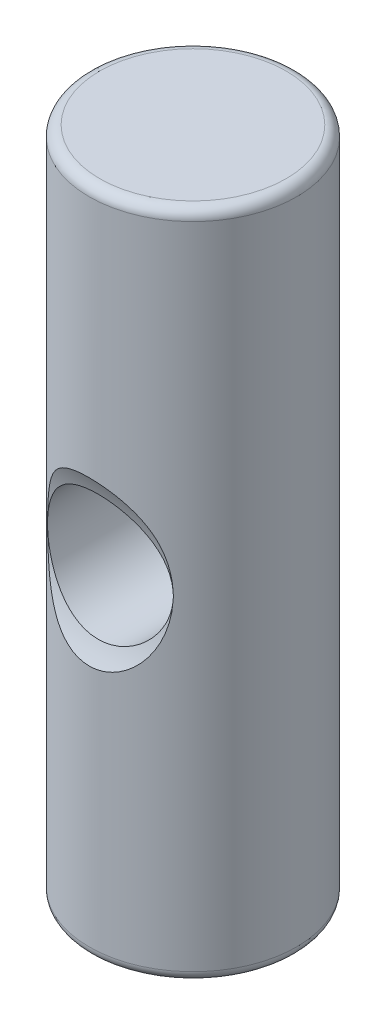
ISO-10303-21;
HEADER;
FILE_DESCRIPTION(('STEP AP214'),'2;1');
FILE_NAME('part.step','',(''),(''),'','','');
FILE_SCHEMA(('AUTOMOTIVE_DESIGN { 1 0 10303 214 1 1 1 1 }'));
ENDSEC;
DATA;
#1=APPLICATION_CONTEXT('core data for automotive mechanical design processes');
#2=APPLICATION_PROTOCOL_DEFINITION('international standard','automotive_design',2000,#1);
#3=PRODUCT_CONTEXT('',#1,'mechanical');
#4=PRODUCT('Part','Part','',(#3));
#5=PRODUCT_RELATED_PRODUCT_CATEGORY('part','',(#4));
#6=PRODUCT_DEFINITION_FORMATION('','',#4);
#7=PRODUCT_DEFINITION_CONTEXT('part definition',#1,'design');
#8=PRODUCT_DEFINITION('design','',#6,#7);
#9=PRODUCT_DEFINITION_SHAPE('','',#8);
#10=(LENGTH_UNIT() NAMED_UNIT(*) SI_UNIT(.MILLI.,.METRE.));
#11=(NAMED_UNIT(*) PLANE_ANGLE_UNIT() SI_UNIT($,.RADIAN.));
#12=(NAMED_UNIT(*) SI_UNIT($,.STERADIAN.) SOLID_ANGLE_UNIT());
#13=UNCERTAINTY_MEASURE_WITH_UNIT(LENGTH_MEASURE(1.E-05),#10,'distance_accuracy_value','');
#14=(GEOMETRIC_REPRESENTATION_CONTEXT(3) GLOBAL_UNCERTAINTY_ASSIGNED_CONTEXT((#13)) GLOBAL_UNIT_ASSIGNED_CONTEXT((#10,
#11,#12)) REPRESENTATION_CONTEXT('',''));
#15=CARTESIAN_POINT('',(0.,0.,0.));
#16=DIRECTION('',(0.,0.,1.));
#17=DIRECTION('',(1.,0.,0.));
#18=AXIS2_PLACEMENT_3D('',#15,#16,#17);
#19=CARTESIAN_POINT('',(0.,8.,0.));
#20=DIRECTION('',(0.,-1.,0.));
#21=DIRECTION('',(0.,0.,-1.));
#22=AXIS2_PLACEMENT_3D('',#19,#20,#21);
#23=CYLINDRICAL_SURFACE('',#22,2.475);
#24=CARTESIAN_POINT('',(0.,-7.75,0.));
#25=DIRECTION('',(0.,1.,0.));
#26=DIRECTION('',(0.,0.,1.));
#27=AXIS2_PLACEMENT_3D('',#24,#25,#26);
#28=CIRCLE('',#27,2.475);
#29=CARTESIAN_POINT('',(0.,-7.75,2.475));
#30=VERTEX_POINT('',#29);
#31=EDGE_CURVE('E117',#30,#30,#28,.T.);
#32=ORIENTED_EDGE('',*,*,#31,.T.);
#33=EDGE_LOOP('',(#32));
#34=FACE_BOUND('',#33,.T.);
#35=CARTESIAN_POINT('',(0.,7.75,0.));
#36=DIRECTION('',(0.,1.,0.));
#37=DIRECTION('',(0.,0.,1.));
#38=AXIS2_PLACEMENT_3D('',#35,#36,#37);
#39=CIRCLE('',#38,2.475);
#40=CARTESIAN_POINT('',(0.,7.75,2.475));
#41=VERTEX_POINT('',#40);
#42=EDGE_CURVE('E114',#41,#41,#39,.F.);
#43=ORIENTED_EDGE('',*,*,#42,.T.);
#44=EDGE_LOOP('',(#43));
#45=FACE_BOUND('',#44,.T.);
#46=CARTESIAN_POINT('',(0.,1.5,-2.475));
#47=CARTESIAN_POINT('',(-0.0766053881282121,1.49999551804604,-2.4749958819399));
#48=CARTESIAN_POINT('',(-0.15332572481813,1.49409084652166,-2.47140502067905));
#49=CARTESIAN_POINT('',(-0.304448020035879,1.47077732998372,-2.45738218524863));
#50=CARTESIAN_POINT('',(-0.378844137842799,1.45334161628485,-2.44693423368573));
#51=CARTESIAN_POINT('',(-0.522812980659744,1.40795434493686,-2.42025330734335));
#52=CARTESIAN_POINT('',(-0.592407629183687,1.38005492975163,-2.40404903812007));
#53=CARTESIAN_POINT('',(-0.725703719010039,1.31486296713071,-2.36722777954795));
#54=CARTESIAN_POINT('',(-0.78940641875841,1.27757243188381,-2.34661173563021));
#55=CARTESIAN_POINT('',(-0.914684512435624,1.19145700903091,-2.30081750734155));
#56=CARTESIAN_POINT('',(-0.975714632596827,1.14196324579128,-2.27540983444243));
#57=CARTESIAN_POINT('',(-1.08913946446989,1.03435878437026,-2.22335417178411));
#58=CARTESIAN_POINT('',(-1.14152278718142,0.976236910075171,-2.19670460456475));
#59=CARTESIAN_POINT('',(-1.24285044269763,0.844439303009929,-2.14118767805534));
#60=CARTESIAN_POINT('',(-1.2905351993591,0.769726826310085,-2.11246251407782));
#61=CARTESIAN_POINT('',(-1.37250225195109,0.611660746855439,-2.06015435154051));
#62=CARTESIAN_POINT('',(-1.40680654391855,0.528321613280411,-2.03656294211595));
#63=CARTESIAN_POINT('',(-1.45365874928512,0.376241841132475,-2.00327624152343));
#64=CARTESIAN_POINT('',(-1.46948177667628,0.308947941166738,-1.99159063093031));
#65=CARTESIAN_POINT('',(-1.49170937637175,0.17203749313028,-1.97500071880473));
#66=CARTESIAN_POINT('',(-1.49812603023623,0.102424042103102,-1.97008771900571));
#67=CARTESIAN_POINT('',(-1.50116687766828,-0.0372928357995179,-1.96777236720827));
#68=CARTESIAN_POINT('',(-1.49777041505652,-0.107396985908149,-1.97038585810485));
#69=CARTESIAN_POINT('',(-1.48136056498844,-0.245843179424537,-1.98274942851548));
#70=CARTESIAN_POINT('',(-1.46833982071866,-0.31418383343345,-1.99250496736589));
#71=CARTESIAN_POINT('',(-1.43365502751269,-0.446359911776743,-2.01759805377976));
#72=CARTESIAN_POINT('',(-1.41212487099955,-0.510247893254975,-2.03284882223724));
#73=CARTESIAN_POINT('',(-1.36122403887812,-0.633664615775135,-2.06727749650608));
#74=CARTESIAN_POINT('',(-1.33185051580506,-0.693191763633334,-2.08645682795733));
#75=CARTESIAN_POINT('',(-1.26008134754264,-0.81744608087654,-2.13070277788847));
#76=CARTESIAN_POINT('',(-1.2162988944869,-0.881215650725249,-2.15620982292677));
#77=CARTESIAN_POINT('',(-1.11963954540092,-1.00117421799417,-2.20795007588231));
#78=CARTESIAN_POINT('',(-1.06675377851855,-1.05735572491257,-2.23418397096822));
#79=CARTESIAN_POINT('',(-0.944268844567257,-1.16883214698505,-2.28890886317755));
#80=CARTESIAN_POINT('',(-0.873357774170553,-1.22281244658069,-2.31717406315694));
#81=CARTESIAN_POINT('',(-0.721773398908434,-1.3179662834763,-2.36876837737908));
#82=CARTESIAN_POINT('',(-0.641105060902724,-1.35914629886485,-2.39209998654216));
#83=CARTESIAN_POINT('',(-0.477193946524547,-1.42463514079224,-2.42992615741784));
#84=CARTESIAN_POINT('',(-0.394411328091216,-1.4498226875284,-2.44487438210115));
#85=CARTESIAN_POINT('',(-0.224718347578044,-1.4855952560478,-2.46625364748532));
#86=CARTESIAN_POINT('',(-0.137813283393501,-1.49619852137535,-2.47269532865674));
#87=CARTESIAN_POINT('',(0.0245315190155584,-1.50168572464453,-2.47602246596044));
#88=CARTESIAN_POINT('',(0.0998876181453653,-1.4985479973408,-2.47411069168431));
#89=CARTESIAN_POINT('',(0.24881147792216,-1.48111791358153,-2.46359210829829));
#90=CARTESIAN_POINT('',(0.322379292754257,-1.46682589553709,-2.45498550230358));
#91=CARTESIAN_POINT('',(0.463693151430326,-1.42835871582118,-2.43220117397594));
#92=CARTESIAN_POINT('',(0.531543975724558,-1.40446807104341,-2.41818425504489));
#93=CARTESIAN_POINT('',(0.662246618124334,-1.34777901448083,-2.38570625373085));
#94=CARTESIAN_POINT('',(0.725097487463432,-1.31497891727078,-2.36724433054953));
#95=CARTESIAN_POINT('',(0.851043739494801,-1.23763384966822,-2.32512407899091));
#96=CARTESIAN_POINT('',(0.913493641128578,-1.19222561492469,-2.30112596010346));
#97=CARTESIAN_POINT('',(1.03035337163936,-1.09282554643898,-2.25123154035229));
#98=CARTESIAN_POINT('',(1.08475375727356,-1.03882378292655,-2.22533306252308));
#99=CARTESIAN_POINT('',(1.19149250058946,-0.915353548551005,-2.17026228601503));
#100=CARTESIAN_POINT('',(1.24257625486081,-0.844782106696785,-2.14111665427702));
#101=CARTESIAN_POINT('',(1.33223693659035,-0.694807793386356,-2.08651116978713));
#102=CARTESIAN_POINT('',(1.37082606378199,-0.615413638799396,-2.0610477352727));
#103=CARTESIAN_POINT('',(1.42710535758552,-0.467151259844422,-2.02235089113682));
#104=CARTESIAN_POINT('',(1.44750604981171,-0.399695629111068,-2.0076647674032));
#105=CARTESIAN_POINT('',(1.4787081972408,-0.261568478057249,-1.98479940374939));
#106=CARTESIAN_POINT('',(1.48952342352507,-0.190901725092067,-1.97661083081837));
#107=CARTESIAN_POINT('',(1.5009527361751,-0.0479547086868969,-1.96794901630975));
#108=CARTESIAN_POINT('',(1.50152401286334,0.0243310625158093,-1.96750815272286));
#109=CARTESIAN_POINT('',(1.49231289350075,0.167868267403431,-1.97450155981874));
#110=CARTESIAN_POINT('',(1.48252525078302,0.239119158396908,-1.98193982118427));
#111=CARTESIAN_POINT('',(1.45403365922075,0.374587904517425,-2.0029220269658));
#112=CARTESIAN_POINT('',(1.43585536752022,0.438976565035245,-2.01610374124118));
#113=CARTESIAN_POINT('',(1.39158071108032,0.563822131272105,-2.04691302304263));
#114=CARTESIAN_POINT('',(1.36548132971969,0.624277528399748,-2.06454228391383));
#115=CARTESIAN_POINT('',(1.3015517666741,0.749415905291774,-2.1055251062746));
#116=CARTESIAN_POINT('',(1.26254083936998,0.813342236099688,-2.12934151839587));
#117=CARTESIAN_POINT('',(1.17579566144711,0.934374880454969,-2.17844388900787));
#118=CARTESIAN_POINT('',(1.12805418638552,0.991475480582625,-2.20373105262489));
#119=CARTESIAN_POINT('',(1.01558780241073,1.10732446162514,-2.25803933300541));
#120=CARTESIAN_POINT('',(0.949354268301779,1.16467144731284,-2.28695582162138));
#121=CARTESIAN_POINT('',(0.806825078061132,1.26757732619844,-2.34103878704066));
#122=CARTESIAN_POINT('',(0.730525271440307,1.31313133388256,-2.36620370784507));
#123=CARTESIAN_POINT('',(0.571399932253989,1.38964413069756,-2.40951557030431));
#124=CARTESIAN_POINT('',(0.488770230311512,1.42092116824435,-2.42781373297619));
#125=CARTESIAN_POINT('',(0.318108913111099,1.46853317934459,-2.45598053752113));
#126=CARTESIAN_POINT('',(0.230098719740936,1.48492375247898,-2.46588053654233));
#127=CARTESIAN_POINT('',(0.117786438002796,1.49555586137624,-2.47230910927808));
#128=CARTESIAN_POINT('',(0.0942752647050698,1.49722022112156,-2.47331616519628));
#129=CARTESIAN_POINT('',(0.0471796981788261,1.49944300544134,-2.47466225971832));
#130=CARTESIAN_POINT('',(0.0235953017188209,1.50000138049109,-2.47500126840778));
#131=CARTESIAN_POINT('',(0.,1.5,-2.475));
#132=B_SPLINE_CURVE_WITH_KNOTS('',3,(#46,#47,#48,#49,#50,#51,#52,#53,#54,#55,#56,#57,#58,#59,
#60,#61,#62,#63,#64,#65,#66,#67,#68,#69,#70,#71,#72,#73,#74,#75,#76,#77,#78,#79,#80,#81,#82,#83,
#84,#85,#86,#87,#88,#89,#90,#91,#92,#93,#94,#95,#96,#97,#98,#99,#100,#101,#102,#103,#104,#105,
#106,#107,#108,#109,#110,#111,#112,#113,#114,#115,#116,#117,#118,#119,#120,#121,#122,#123,#124,
#125,#126,#127,#128,#129,#130,#131),.UNSPECIFIED.,.T.,.F.,(4,2,2,2,2,2,2,2,2,2,2,2,2,2,2,2,2,2,
2,2,2,2,2,2,2,2,2,2,2,2,2,2,2,2,2,2,2,2,2,2,2,2,4),(0.,0.229715516826993,0.459968192681149,
0.689088403348344,0.918159563269188,1.16494157550401,1.41204608319693,1.69020586828811,
1.96790644195342,2.17734932129442,2.38652295547427,2.59613721154648,2.80591186294934,
3.01250940779975,3.21918205827473,3.4626055213448,3.70626754877632,3.9853292058518,
4.26424940195858,4.52608929044527,4.7876013434222,5.01279978826006,5.23799140104611,
5.45694968498182,5.67594941873054,5.91757293494193,6.15947770048343,6.43381918809067,
6.70789199563877,6.92297334880613,7.13774519937795,7.35341437775559,7.56919284225149,
7.7729814998316,7.97684786468095,8.21173761906871,8.44682262925334,8.72228407228457,
8.99785944962873,9.26694955575388,9.53503045186706,9.60578218836103,9.67653709296325),.UNSPECIFIED.);
#133=CARTESIAN_POINT('',(0.,1.5,-2.475));
#134=VERTEX_POINT('',#133);
#135=EDGE_CURVE('E75',#134,#134,#132,.T.);
#136=ORIENTED_EDGE('',*,*,#135,.T.);
#137=EDGE_LOOP('',(#136));
#138=FACE_BOUND('',#137,.T.);
#139=CARTESIAN_POINT('',(1.5,0.,1.968660712261));
#140=CARTESIAN_POINT('',(1.49998933785901,-0.0751347802215993,1.96867612276547));
#141=CARTESIAN_POINT('',(1.49430429271254,-0.150386610544893,1.97304143196897));
#142=CARTESIAN_POINT('',(1.47193253957732,-0.298433249902011,1.98977813801894));
#143=CARTESIAN_POINT('',(1.45521204119822,-0.371219788306018,2.00217412251826));
#144=CARTESIAN_POINT('',(1.41191311988525,-0.51172620951829,2.03293349390277));
#145=CARTESIAN_POINT('',(1.38541576517094,-0.579482403524716,2.05124765723317));
#146=CARTESIAN_POINT('',(1.32355234208344,-0.70950626696608,2.09169716431594));
#147=CARTESIAN_POINT('',(1.28818706630859,-0.77177442623954,2.11383216651376));
#148=CARTESIAN_POINT('',(1.2044256806273,-0.897644916161882,2.16278021900052));
#149=CARTESIAN_POINT('',(1.15495235840232,-0.96043787394174,2.18983197231347));
#150=CARTESIAN_POINT('',(1.04658216523043,-1.07751348667846,2.24364812290863));
#151=CARTESIAN_POINT('',(0.987677454509613,-1.13178898658233,2.27041226118785));
#152=CARTESIAN_POINT('',(0.854197005247918,-1.23624320229102,2.32415562958418));
#153=CARTESIAN_POINT('',(0.778607728076405,-1.28529956811332,2.35082937167349));
#154=CARTESIAN_POINT('',(0.618324837999555,-1.36961652222183,2.39796831278536));
#155=CARTESIAN_POINT('',(0.533639877461185,-1.40489007594828,2.41843934258506));
#156=CARTESIAN_POINT('',(0.366239543205615,-1.45697940789278,2.44908486118995));
#157=CARTESIAN_POINT('',(0.284129198523004,-1.47525312138077,2.46006518664389));
#158=CARTESIAN_POINT('',(0.117351231818273,-1.49776108958418,2.47362648489095));
#159=CARTESIAN_POINT('',(0.0326861618463729,-1.50200891565281,2.47621557693962));
#160=CARTESIAN_POINT('',(-0.125245085420282,-1.49658122442149,2.47292990514327));
#161=CARTESIAN_POINT('',(-0.198599013034252,-1.48859823735179,2.46808390282459));
#162=CARTESIAN_POINT('',(-0.342695882492062,-1.46216434816912,2.45223111109549));
#163=CARTESIAN_POINT('',(-0.413438627002566,-1.44371265662921,2.44122385707656));
#164=CARTESIAN_POINT('',(-0.550926099681359,-1.39706203764586,2.41392813516983));
#165=CARTESIAN_POINT('',(-0.617648758798449,-1.36881420520218,2.39761319565824));
#166=CARTESIAN_POINT('',(-0.745481928119586,-1.30361441556262,2.36099739294558));
#167=CARTESIAN_POINT('',(-0.806591021322761,-1.26666026902655,2.34069552738308));
#168=CARTESIAN_POINT('',(-0.92937174033612,-1.18007363966676,2.29492616361096));
#169=CARTESIAN_POINT('',(-0.990220832900496,-1.12944920441835,2.26913093801424));
#170=CARTESIAN_POINT('',(-1.10308432634521,-1.01952113840031,2.2164652927502));
#171=CARTESIAN_POINT('',(-1.15508631507156,-0.960205527737202,2.18959342680105));
#172=CARTESIAN_POINT('',(-1.25506461513586,-0.826204867083255,2.13402919163245));
#173=CARTESIAN_POINT('',(-1.30181853214853,-0.750530303702955,2.10550265257391));
#174=CARTESIAN_POINT('',(-1.38170801329189,-0.590620470092669,2.05396669286681));
#175=CARTESIAN_POINT('',(-1.41486874524891,-0.506401384212728,2.03094710929387));
#176=CARTESIAN_POINT('',(-1.45935465750997,-0.353461142496586,1.99911488967872));
#177=CARTESIAN_POINT('',(-1.47407393629595,-0.286169033781605,1.98818527321894));
#178=CARTESIAN_POINT('',(-1.49412549604064,-0.149482386630283,1.97316451088369));
#179=CARTESIAN_POINT('',(-1.49946913827419,-0.0800904966056877,1.9690650885716));
#180=CARTESIAN_POINT('',(-1.50045610942901,0.0589121353536169,1.96831329168966));
#181=CARTESIAN_POINT('',(-1.49608405919664,0.128523049841569,1.97167272387445));
#182=CARTESIAN_POINT('',(-1.47788613885023,0.265813447213746,1.98534651425542));
#183=CARTESIAN_POINT('',(-1.46405269125395,0.333491336676806,1.99566644691352));
#184=CARTESIAN_POINT('',(-1.42774038219593,0.46496521570096,2.02179953274353));
#185=CARTESIAN_POINT('',(-1.4053021020396,0.528777822757841,2.03758686768813));
#186=CARTESIAN_POINT('',(-1.35258421092619,0.651926665752525,2.07295605148923));
#187=CARTESIAN_POINT('',(-1.3223016908923,0.711261230420776,2.09253930740297));
#188=CARTESIAN_POINT('',(-1.24837044534937,0.835280504230457,2.13761387116155));
#189=CARTESIAN_POINT('',(-1.20328994508581,0.898958019230635,2.16353058919881));
#190=CARTESIAN_POINT('',(-1.10393607255557,1.01851639155471,2.21587669060527));
#191=CARTESIAN_POINT('',(-1.04965369133431,1.07438950937858,2.24230655368888));
#192=CARTESIAN_POINT('',(-0.924568299065763,1.18449524294051,2.29696898733886));
#193=CARTESIAN_POINT('',(-0.852520727620792,1.23745380786085,2.32495226793004));
#194=CARTESIAN_POINT('',(-0.698778798729983,1.33032145480244,2.37568277422405));
#195=CARTESIAN_POINT('',(-0.6170905034052,1.37023867837889,2.3984332640601));
#196=CARTESIAN_POINT('',(-0.452182152748934,1.43274145358241,2.43470174680772));
#197=CARTESIAN_POINT('',(-0.369470238689291,1.45634521203136,2.4487548379341));
#198=CARTESIAN_POINT('',(-0.200280601761309,1.48905527565694,2.46834634574078));
#199=CARTESIAN_POINT('',(-0.113807486528535,1.49817883288465,2.47389489466142));
#200=CARTESIAN_POINT('',(0.0475952287034627,1.50111314970111,2.47567583113894));
#201=CARTESIAN_POINT('',(0.122485026518561,1.49684867483183,2.47307926788708));
#202=CARTESIAN_POINT('',(0.270279607625626,1.47732952129296,2.46131390073155));
#203=CARTESIAN_POINT('',(0.343184391837541,1.46207484771683,2.45214509987382));
#204=CARTESIAN_POINT('',(0.483597171735586,1.42174799751963,2.42831942757178));
#205=CARTESIAN_POINT('',(0.551184566211598,1.3968809205882,2.41377747173269));
#206=CARTESIAN_POINT('',(0.68122269045838,1.33829226509551,2.38035147481433));
#207=CARTESIAN_POINT('',(0.743672366365836,1.30456887582015,2.36146654589235));
#208=CARTESIAN_POINT('',(0.868924920872152,1.22517178948961,2.31849879648395));
#209=CARTESIAN_POINT('',(0.931041432209542,1.17860219903307,2.29407521179875));
#210=CARTESIAN_POINT('',(1.0470575030225,1.07686330077263,2.24350394696577));
#211=CARTESIAN_POINT('',(1.10094739043051,1.02168402225867,2.21735428840194));
#212=CARTESIAN_POINT('',(1.20626284911935,0.895836356536479,2.16206726490184));
#213=CARTESIAN_POINT('',(1.25643396316319,0.824085412648375,2.13298885763666));
#214=CARTESIAN_POINT('',(1.34403769990322,0.671757881847757,2.07890467340783));
#215=CARTESIAN_POINT('',(1.38148025102765,0.591188238777387,2.05389573019005));
#216=CARTESIAN_POINT('',(1.43519041688056,0.441653629791736,2.01659957455637));
#217=CARTESIAN_POINT('',(1.45431927203632,0.374114068429147,2.00271866284935));
#218=CARTESIAN_POINT('',(1.48295693475653,0.236138918203055,1.98161420255699));
#219=CARTESIAN_POINT('',(1.49249775349724,0.165713788532415,1.97436850848939));
#220=CARTESIAN_POINT('',(1.49900102925811,0.0633126296686734,1.96942040822052));
#221=CARTESIAN_POINT('',(1.50000449372361,0.0316667108199817,1.96865421726644));
#222=CARTESIAN_POINT('',(1.5,0.,1.968660712261));
#223=B_SPLINE_CURVE_WITH_KNOTS('',3,(#139,#140,#141,#142,#143,#144,#145,#146,#147,#148,#149,
#150,#151,#152,#153,#154,#155,#156,#157,#158,#159,#160,#161,#162,#163,#164,#165,#166,#167,#168,
#169,#170,#171,#172,#173,#174,#175,#176,#177,#178,#179,#180,#181,#182,#183,#184,#185,#186,#187,
#188,#189,#190,#191,#192,#193,#194,#195,#196,#197,#198,#199,#200,#201,#202,#203,#204,#205,#206,
#207,#208,#209,#210,#211,#212,#213,#214,#215,#216,#217,#218,#219,#220,#221,#222),.UNSPECIFIED.,
.T.,.F.,(4,2,2,2,2,2,2,2,2,2,2,2,2,2,2,2,2,2,2,2,2,2,2,2,2,2,2,2,2,2,2,2,2,2,2,2,2,2,2,2,2,4),
(0.,0.225289648744197,0.451272351434305,0.675421872382829,0.899551366399387,1.15174745673066,
1.40415428212074,1.68456072902067,1.96470275989839,2.21768500313281,2.47042239062706,
2.69120419387121,2.91200264810342,3.13391964545483,3.35589250701541,3.6046600540123,
3.85377378481391,4.13263729047353,4.41098212163158,4.61932602688272,4.82741728886733,
5.03583817704414,5.24442618194665,5.45204232661232,5.65973557730446,5.90542673362174,
6.15135983403263,6.43099475654609,6.71045477121277,6.97033868046671,7.22991272487771,
7.45396255320639,7.67801227769809,7.89752413896404,8.11708091543543,8.36028454825864,
8.60377194995577,8.87925631206416,9.15452529743314,9.3683346944166,9.58142785941911,
9.67637965320192),.UNSPECIFIED.);
#224=CARTESIAN_POINT('',(-1.49652963235444,-0.101975778913817,1.97130009371609));
#225=VERTEX_POINT('',#224);
#226=CARTESIAN_POINT('',(-1.49652963235444,0.101975778913809,1.97130009371609));
#227=VERTEX_POINT('',#226);
#228=EDGE_CURVE('E79',#225,#227,#223,.T.);
#229=ORIENTED_EDGE('',*,*,#228,.T.);
#230=CARTESIAN_POINT('',(-1.49824063487812,0.,1.97));
#231=CARTESIAN_POINT('',(-1.49824698940928,0.123825268896985,1.9700070965718));
#232=CARTESIAN_POINT('',(-1.49072435461227,0.247784691883498,1.97578537585281));
#233=CARTESIAN_POINT('',(-1.46000428985808,0.493097396279785,1.99859514024376));
#234=CARTESIAN_POINT('',(-1.43676246875193,0.614442290116733,2.01565849148815));
#235=CARTESIAN_POINT('',(-1.38881168576208,0.791909271315845,2.048703763549));
#236=CARTESIAN_POINT('',(-1.3705536519637,0.850517013160983,2.06102074887237));
#237=CARTESIAN_POINT('',(-1.32935552600197,0.96553522459957,2.0878333610657));
#238=CARTESIAN_POINT('',(-1.30641788882981,1.02194682791731,2.10232784454012));
#239=CARTESIAN_POINT('',(-1.25561806011567,1.13185950592454,2.13305546861858));
#240=CARTESIAN_POINT('',(-1.22776726923221,1.18536695155315,2.14928455055976));
#241=CARTESIAN_POINT('',(-1.16685682426585,1.28888822350864,2.18295222188079));
#242=CARTESIAN_POINT('',(-1.13380003772451,1.33890395136533,2.20039014247108));
#243=CARTESIAN_POINT('',(-1.05013106434987,1.45094593209932,2.2418083268576));
#244=CARTESIAN_POINT('',(-0.997362265597666,1.51131513587042,2.26600709680422));
#245=CARTESIAN_POINT('',(-0.882080757067164,1.62244071503941,2.31331533535129));
#246=CARTESIAN_POINT('',(-0.819572773174826,1.67320172643812,2.33642532522975));
#247=CARTESIAN_POINT('',(-0.685051101738513,1.7634660902494,2.37935744290047));
#248=CARTESIAN_POINT('',(-0.612967950332594,1.80287978282898,2.39915289418135));
#249=CARTESIAN_POINT('',(-0.461576211227074,1.86805919504684,2.43280891011861));
#250=CARTESIAN_POINT('',(-0.382272637615789,1.89383430229214,2.44667355575927));
#251=CARTESIAN_POINT('',(-0.229880973197706,1.92813024126757,2.46533990417709));
#252=CARTESIAN_POINT('',(-0.157308121902332,1.93844597232833,2.47107898139212));
#253=CARTESIAN_POINT('',(-0.011235848293663,1.94739575650131,2.47605078646124));
#254=CARTESIAN_POINT('',(0.0622631221809113,1.94603530146621,2.47528657311639));
#255=CARTESIAN_POINT('',(0.202592726616395,1.93220620806035,2.4676251549657));
#256=CARTESIAN_POINT('',(0.269527728816335,1.92052880459511,2.46116486785429));
#257=CARTESIAN_POINT('',(0.400272187550194,1.88753868671462,2.44330942328806));
#258=CARTESIAN_POINT('',(0.464081837165783,1.86622656835829,2.43191457111566));
#259=CARTESIAN_POINT('',(0.588406037641362,1.81409287685075,2.40489960194999));
#260=CARTESIAN_POINT('',(0.648818584156258,1.78307434304063,2.38919288380616));
#261=CARTESIAN_POINT('',(0.763670386345134,1.71269070879701,2.35500092705228));
#262=CARTESIAN_POINT('',(0.818108148129002,1.67332352811281,2.33651499627448));
#263=CARTESIAN_POINT('',(0.925584154274619,1.58299946590626,2.2962022371171));
#264=CARTESIAN_POINT('',(0.977915354409979,1.53127060367042,2.27422689380425));
#265=CARTESIAN_POINT('',(1.07433495942282,1.42063552833262,2.23030067942293));
#266=CARTESIAN_POINT('',(1.11841677263649,1.36172363718675,2.20834984173859));
#267=CARTESIAN_POINT('',(1.21611884149203,1.21111807964286,2.15660746179117));
#268=CARTESIAN_POINT('',(1.26545949180727,1.11636828459008,2.12759306701862));
#269=CARTESIAN_POINT('',(1.34900851235886,0.918879360855247,2.07562677798898));
#270=CARTESIAN_POINT('',(1.38319422398865,0.816128537427397,2.05268398206455));
#271=CARTESIAN_POINT('',(1.43834669452186,0.604311559267127,2.01442887681291));
#272=CARTESIAN_POINT('',(1.4591312512232,0.495179499316072,1.99922231138761));
#273=CARTESIAN_POINT('',(1.48792802189306,0.27440356368137,1.97787985450348));
#274=CARTESIAN_POINT('',(1.49593790950592,0.162759234249217,1.9717456151928));
#275=CARTESIAN_POINT('',(1.50002518093662,-0.0808477704304897,1.96864932790743));
#276=CARTESIAN_POINT('',(1.4937194488456,-0.212882735518315,1.97351839282022));
#277=CARTESIAN_POINT('',(1.46352644104049,-0.473895870714606,1.99601517515129));
#278=CARTESIAN_POINT('',(1.4396385165635,-0.602873927845371,2.01364336336629));
#279=CARTESIAN_POINT('',(1.3782137257438,-0.831867776252609,2.05603319934755));
#280=CARTESIAN_POINT('',(1.34375257456517,-0.933034207923563,2.07903346254556));
#281=CARTESIAN_POINT('',(1.25996758048137,-1.12738807004419,2.13085268299906));
#282=CARTESIAN_POINT('',(1.21066833710102,-1.22058838136573,2.15966198377226));
#283=CARTESIAN_POINT('',(1.10743931382083,-1.37770001702009,2.21401585427664));
#284=CARTESIAN_POINT('',(1.05646022910253,-1.44372350180535,2.23904309547294));
#285=CARTESIAN_POINT('',(0.943855456938863,-1.56621401751071,2.28878609337506));
#286=CARTESIAN_POINT('',(0.882232820771373,-1.62268377811952,2.31350193717899));
#287=CARTESIAN_POINT('',(0.748293194453945,-1.72418452808781,2.36024228584137));
#288=CARTESIAN_POINT('',(0.675888917725225,-1.7691131314039,2.38224185835653));
#289=CARTESIAN_POINT('',(0.522563920775881,-1.84466191230377,2.42048766275138));
#290=CARTESIAN_POINT('',(0.441651286930971,-1.87529552795986,2.43673929451668));
#291=CARTESIAN_POINT('',(0.286652214429517,-1.91734248856863,2.45940442913591));
#292=CARTESIAN_POINT('',(0.213307406801143,-1.93091722549333,2.46691195166839));
#293=CARTESIAN_POINT('',(0.0650223418235845,-1.94598342528706,2.4752568602865));
#294=CARTESIAN_POINT('',(-0.00991702382353958,-1.94748147236612,2.47609788094407));
#295=CARTESIAN_POINT('',(-0.152440951412635,-1.93873967316553,2.47124261710184));
#296=CARTESIAN_POINT('',(-0.220108290017569,-1.92948873412947,2.4660970462485));
#297=CARTESIAN_POINT('',(-0.352722141846439,-1.90115954379638,2.45064631667871));
#298=CARTESIAN_POINT('',(-0.41766900011739,-1.88208254287538,2.44034181444601));
#299=CARTESIAN_POINT('',(-0.543939813090474,-1.83445804751876,2.41535680991968));
#300=CARTESIAN_POINT('',(-0.605214232678578,-1.80580543447504,2.40062792803669));
#301=CARTESIAN_POINT('',(-0.722100843627982,-1.74001037063319,2.36809671215622));
#302=CARTESIAN_POINT('',(-0.777711684534552,-1.7028659018096,2.35029364784894));
#303=CARTESIAN_POINT('',(-0.887367774166414,-1.61739975318604,2.31125518624621));
#304=CARTESIAN_POINT('',(-0.940794368241055,-1.56836272056572,2.2898546493485));
#305=CARTESIAN_POINT('',(-1.03965781146224,-1.462968025387,2.24669791551055));
#306=CARTESIAN_POINT('',(-1.08508933432683,-1.40660552576865,2.2249414919475));
#307=CARTESIAN_POINT('',(-1.18578701961543,-1.26269047805183,2.17347041644069));
#308=CARTESIAN_POINT('',(-1.23699078357028,-1.1720836231289,2.14431647487044));
#309=CARTESIAN_POINT('',(-1.32467491987917,-0.98252369661265,2.09129078681605));
#310=CARTESIAN_POINT('',(-1.36112561819802,-0.883554283014128,2.06742972945222));
#311=CARTESIAN_POINT('',(-1.42117218483698,-0.678883651708586,2.02662926682776));
#312=CARTESIAN_POINT('',(-1.44457509162002,-0.573105936418788,2.00979464183382));
#313=CARTESIAN_POINT('',(-1.47891454142116,-0.358768276568537,1.98466506551405));
#314=CARTESIAN_POINT('',(-1.48987614043748,-0.250214375798346,1.97635295366785));
#315=CARTESIAN_POINT('',(-1.49714446589856,-0.0942669532594187,1.970831131827));
#316=CARTESIAN_POINT('',(-1.49823821555828,-0.0471431994770756,1.96999729816779));
#317=CARTESIAN_POINT('',(-1.49824063487812,0.,1.97));
#318=B_SPLINE_CURVE_WITH_KNOTS('',3,(#230,#231,#232,#233,#234,#235,#236,#237,#238,#239,#240,
#241,#242,#243,#244,#245,#246,#247,#248,#249,#250,#251,#252,#253,#254,#255,#256,#257,#258,#259,
#260,#261,#262,#263,#264,#265,#266,#267,#268,#269,#270,#271,#272,#273,#274,#275,#276,#277,#278,
#279,#280,#281,#282,#283,#284,#285,#286,#287,#288,#289,#290,#291,#292,#293,#294,#295,#296,#297,
#298,#299,#300,#301,#302,#303,#304,#305,#306,#307,#308,#309,#310,#311,#312,#313,#314,#315,#316,
#317),.UNSPECIFIED.,.T.,.F.,(4,2,2,2,2,2,2,2,2,2,2,2,2,2,2,2,2,2,2,2,2,2,2,2,2,2,2,2,2,2,2,2,2,
2,2,2,2,2,2,2,2,2,2,4),(0.,0.371369368293806,0.743791891026306,0.93141136178854,
1.11893265646158,1.30602441023479,1.49301346915334,1.74322720880876,1.99331990960203,
2.24533762285769,2.49718164280898,2.71658475435609,2.9358846760862,3.13969782833827,
3.343498373261,3.55173661413209,3.76002680327632,3.98952797010144,4.21921174380302,
4.54950184239264,4.88028411577241,5.21547382396649,5.5507245655591,5.94577112057587,
6.34083225309198,6.66755670601774,6.99374245054643,7.25398925208974,7.51416156991481,
7.77656793351156,8.03872712132229,8.2624008788567,8.48595268122942,8.69046345533677,
8.89494821167406,9.10175581711855,9.30861262001107,9.53456904672531,9.76067543942919,
10.0831597038087,10.4062894214046,10.7340790288001,11.0612073109576,11.2025963857814),.UNSPECIFIED.);
#319=CARTESIAN_POINT('',(1.49652963235472,0.101975778909727,1.97130009371599));
#320=VERTEX_POINT('',#319);
#321=EDGE_CURVE('E56',#227,#320,#318,.T.);
#322=ORIENTED_EDGE('',*,*,#321,.T.);
#323=CARTESIAN_POINT('',(1.49652963235445,-0.101975778915452,1.97130009371829));
#324=VERTEX_POINT('',#323);
#325=EDGE_CURVE('E80',#320,#324,#223,.T.);
#326=ORIENTED_EDGE('',*,*,#325,.T.);
#327=EDGE_CURVE('E63',#324,#225,#318,.T.);
#328=ORIENTED_EDGE('',*,*,#327,.T.);
#329=EDGE_LOOP('',(#229,#322,#326,#328));
#330=FACE_BOUND('',#329,.T.);
#331=ADVANCED_FACE('F42',(#34,#45,#138,#330),#23,.T.);
#332=CARTESIAN_POINT('',(0.,8.,0.));
#333=DIRECTION('',(0.,1.,0.));
#334=DIRECTION('',(0.,0.,1.));
#335=AXIS2_PLACEMENT_3D('',#332,#333,#334);
#336=PLANE('',#335);
#337=CARTESIAN_POINT('',(0.,8.,0.));
#338=DIRECTION('',(0.,1.,0.));
#339=DIRECTION('',(0.,0.,1.));
#340=AXIS2_PLACEMENT_3D('',#337,#338,#339);
#341=CIRCLE('',#340,2.225);
#342=CARTESIAN_POINT('',(0.,8.,2.225));
#343=VERTEX_POINT('',#342);
#344=EDGE_CURVE('E11',#343,#343,#341,.T.);
#345=ORIENTED_EDGE('',*,*,#344,.T.);
#346=EDGE_LOOP('',(#345));
#347=FACE_BOUND('',#346,.T.);
#348=ADVANCED_FACE('F107',(#347),#336,.T.);
#349=CARTESIAN_POINT('',(0.,-8.,0.));
#350=DIRECTION('',(0.,1.,0.));
#351=DIRECTION('',(0.,0.,1.));
#352=AXIS2_PLACEMENT_3D('',#349,#350,#351);
#353=PLANE('',#352);
#354=CARTESIAN_POINT('',(0.,-8.,0.));
#355=DIRECTION('',(0.,1.,0.));
#356=DIRECTION('',(0.,0.,1.));
#357=AXIS2_PLACEMENT_3D('',#354,#355,#356);
#358=CIRCLE('',#357,2.225);
#359=CARTESIAN_POINT('',(0.,-8.,2.225));
#360=VERTEX_POINT('',#359);
#361=EDGE_CURVE('E50',#360,#360,#358,.F.);
#362=ORIENTED_EDGE('',*,*,#361,.T.);
#363=EDGE_LOOP('',(#362));
#364=FACE_BOUND('',#363,.T.);
#365=ADVANCED_FACE('F104',(#364),#353,.F.);
#366=CARTESIAN_POINT('',(0.,0.,-2.475));
#367=DIRECTION('',(0.,0.,1.));
#368=DIRECTION('',(1.,0.,0.));
#369=AXIS2_PLACEMENT_3D('',#366,#367,#368);
#370=CYLINDRICAL_SURFACE('',#369,1.5);
#371=ORIENTED_EDGE('',*,*,#325,.F.);
#372=CARTESIAN_POINT('',(1.5,0.,1.97));
#373=CARTESIAN_POINT('',(1.50000290230311,0.0812350589378528,1.96999782543849));
#374=CARTESIAN_POINT('',(1.49338023975162,0.162450241781792,1.97249620716816));
#375=CARTESIAN_POINT('',(1.46717180473007,0.322453452352361,1.98221303993072));
#376=CARTESIAN_POINT('',(1.44758789952943,0.401241827987616,1.98943081106007));
#377=CARTESIAN_POINT('',(1.39624699822824,0.554060784990879,2.00781167608455));
#378=CARTESIAN_POINT('',(1.36451348317821,0.628100224162277,2.0189671565056));
#379=CARTESIAN_POINT('',(1.28989358698418,0.769799310160253,2.04411232234647));
#380=CARTESIAN_POINT('',(1.24700421445584,0.837457239177879,2.05810276772452));
#381=CARTESIAN_POINT('',(1.14938746892909,0.967346417045825,2.08813753028783));
#382=CARTESIAN_POINT('',(1.0942697377406,1.02927073015119,2.10423997416434));
#383=CARTESIAN_POINT('',(0.974589565341157,1.14324421474363,2.13639779128673));
#384=CARTESIAN_POINT('',(0.910024243912125,1.19529036359203,2.15245314864967));
#385=CARTESIAN_POINT('',(0.77028253247679,1.28998202215985,2.18337529382269));
#386=CARTESIAN_POINT('',(0.694795633454181,1.3321939319576,2.19817351179181));
#387=CARTESIAN_POINT('',(0.537151645831477,1.40318646334084,2.22400139762567));
#388=CARTESIAN_POINT('',(0.454997236844898,1.43197244961239,2.23503257024119));
#389=CARTESIAN_POINT('',(0.2898832597418,1.47408431017549,2.25145587175864));
#390=CARTESIAN_POINT('',(0.207094961564558,1.48799593218558,2.25706075649162));
#391=CARTESIAN_POINT('',(0.0401838420061582,1.50179556531648,2.26261938538785));
#392=CARTESIAN_POINT('',(-0.04393841387447,1.50168936802631,2.26257546340695));
#393=CARTESIAN_POINT('',(-0.205769525212957,1.48790429610018,2.25702488367945));
#394=CARTESIAN_POINT('',(-0.283560906044178,1.47503808509003,2.25184531128878));
#395=CARTESIAN_POINT('',(-0.435787150405318,1.4374416786833,2.23715061940471));
#396=CARTESIAN_POINT('',(-0.51022150661388,1.41270969663258,2.22763484701137));
#397=CARTESIAN_POINT('',(-0.655277067728232,1.35163748571904,2.20514297809747));
#398=CARTESIAN_POINT('',(-0.725799486121303,1.31508648737101,2.19210482011834));
#399=CARTESIAN_POINT('',(-0.859945737590972,1.23156073762698,2.16405789860681));
#400=CARTESIAN_POINT('',(-0.9235671775197,1.18458238728897,2.14904845542842));
#401=CARTESIAN_POINT('',(-1.04660366365088,1.07781780766549,2.11751961140887));
#402=CARTESIAN_POINT('',(-1.10544864074809,1.01738298716956,2.10096652544329));
#403=CARTESIAN_POINT('',(-1.2123379662058,0.887312590819021,2.06908271835914));
#404=CARTESIAN_POINT('',(-1.26038065460567,0.817675603497364,2.05375218534048));
#405=CARTESIAN_POINT('',(-1.34493039706252,0.66972343699242,2.0257360519092));
#406=CARTESIAN_POINT('',(-1.38124758122106,0.591290713844719,2.01309501740384));
#407=CARTESIAN_POINT('',(-1.43998260427004,0.428836850524583,1.99221281673038));
#408=CARTESIAN_POINT('',(-1.46240661656112,0.344818210845767,1.98396969658507));
#409=CARTESIAN_POINT('',(-1.49162278754194,0.178375243148665,1.97315556771935));
#410=CARTESIAN_POINT('',(-1.49918260638251,0.0961036195622096,1.97030630974314));
#411=CARTESIAN_POINT('',(-1.50069106389992,-0.068572475255024,1.96974106299874));
#412=CARTESIAN_POINT('',(-1.49464272031678,-0.150976912983373,1.97202393613137));
#413=CARTESIAN_POINT('',(-1.46968995769133,-0.310262048561859,1.98128290227357));
#414=CARTESIAN_POINT('',(-1.45128845626292,-0.387233328007336,1.98807529037695));
#415=CARTESIAN_POINT('',(-1.40281392745268,-0.536941754957221,2.00548522908283));
#416=CARTESIAN_POINT('',(-1.37273938205196,-0.609678350347534,2.0161032771797));
#417=CARTESIAN_POINT('',(-1.30081358756053,-0.751247765110156,2.04050375592318));
#418=CARTESIAN_POINT('',(-1.25864227077661,-0.819903083557796,2.05436999790652));
#419=CARTESIAN_POINT('',(-1.16408189682844,-0.949392711726626,2.08373328435336));
#420=CARTESIAN_POINT('',(-1.11168906745485,-1.01022412027045,2.09923092990484));
#421=CARTESIAN_POINT('',(-0.994595877875726,-1.12603079874454,2.1312667050901));
#422=CARTESIAN_POINT('',(-0.929357817227302,-1.18046154123568,2.14781303496271));
#423=CARTESIAN_POINT('',(-0.790348615292344,-1.27771050031903,2.17921184253146));
#424=CARTESIAN_POINT('',(-0.7165767086115,-1.32052767414518,2.19406416805601));
#425=CARTESIAN_POINT('',(-0.561984013227687,-1.39337773518998,2.22033170177537));
#426=CARTESIAN_POINT('',(-0.481135254089564,-1.42335685446918,2.23173239671507));
#427=CARTESIAN_POINT('',(-0.314990236312178,-1.46907883466889,2.24945967108995));
#428=CARTESIAN_POINT('',(-0.229696763801877,-1.48483050305535,2.25578938942509));
#429=CARTESIAN_POINT('',(-0.0629838404588859,-1.50086347097839,2.26224105207427));
#430=CARTESIAN_POINT('',(0.0183326317168855,-1.50207331495837,2.26273555476659));
#431=CARTESIAN_POINT('',(0.179945316276165,-1.49136715641593,2.25841587254708));
#432=CARTESIAN_POINT('',(0.260241624671583,-1.47945239850124,2.25360219101101));
#433=CARTESIAN_POINT('',(0.415047226716551,-1.44355815630242,2.23951858414568));
#434=CARTESIAN_POINT('',(0.489658346245345,-1.41995798316524,2.23038914623337));
#435=CARTESIAN_POINT('',(0.63390550849442,-1.3616969677992,2.20878451702155));
#436=CARTESIAN_POINT('',(0.703540288070142,-1.32703332944945,2.19630848004785));
#437=CARTESIAN_POINT('',(0.839826789697631,-1.24552075938154,2.16860276096035));
#438=CARTESIAN_POINT('',(0.90613079679991,-1.1981283280301,2.15326301559036));
#439=CARTESIAN_POINT('',(1.0301415609712,-1.09334485729906,2.12193753242823));
#440=CARTESIAN_POINT('',(1.08784557478675,-1.03595064012808,2.10595159056855));
#441=CARTESIAN_POINT('',(1.19620195582184,-0.909080396784624,2.07409575390119));
#442=CARTESIAN_POINT('',(1.24630375343467,-0.839118644212993,2.05827895099355));
#443=CARTESIAN_POINT('',(1.33402265527656,-0.691213223200822,2.02945485542969));
#444=CARTESIAN_POINT('',(1.37163878773637,-0.613268934090622,2.01644778148441));
#445=CARTESIAN_POINT('',(1.43437682904833,-0.447999082002312,1.9942570739332));
#446=CARTESIAN_POINT('',(1.4588870646019,-0.360413422234209,1.98526342841644));
#447=CARTESIAN_POINT('',(1.49169295992068,-0.181875733606382,1.97313757820413));
#448=CARTESIAN_POINT('',(1.49999675148732,-0.090925416364859,1.97000243396033));
#449=CARTESIAN_POINT('',(1.5,0.,1.97));
#450=B_SPLINE_CURVE_WITH_KNOTS('',3,(#372,#373,#374,#375,#376,#377,#378,#379,#380,#381,#382,
#383,#384,#385,#386,#387,#388,#389,#390,#391,#392,#393,#394,#395,#396,#397,#398,#399,#400,#401,
#402,#403,#404,#405,#406,#407,#408,#409,#410,#411,#412,#413,#414,#415,#416,#417,#418,#419,#420,
#421,#422,#423,#424,#425,#426,#427,#428,#429,#430,#431,#432,#433,#434,#435,#436,#437,#438,#439,
#440,#441,#442,#443,#444,#445,#446,#447,#448,#449),.UNSPECIFIED.,.T.,.F.,(4,2,2,2,2,2,2,2,2,2,2,
2,2,2,2,2,2,2,2,2,2,2,2,2,2,2,2,2,2,2,2,2,2,2,2,2,2,2,4),(0.,0.24336980156056,0.48670454953046,
0.729571369213573,0.97250337960949,1.22473618582715,1.47704604925622,1.73896674501659,
2.00078269352134,2.25185874416901,2.50283106079707,2.73878345119971,2.97477138060589,
3.21522408387018,3.45575990744258,3.71246153335813,3.96920257905066,4.22991375286075,
4.49050899698846,4.73725019635925,4.9839366839052,5.2211443792384,5.45838293254453,
5.702592218596,5.94689180019868,6.20536519455658,6.46386178920141,6.72343066727204,
6.98283874956507,7.22558763480252,7.46831350211259,7.70363142426533,7.93900886656506,
8.18672471884271,8.43451941997062,8.69572329654039,8.95694749805102,9.22948515032042,
9.50188601796127),.UNSPECIFIED.);
#451=EDGE_CURVE('E74',#320,#227,#450,.T.);
#452=ORIENTED_EDGE('',*,*,#451,.T.);
#453=ORIENTED_EDGE('',*,*,#228,.F.);
#454=EDGE_CURVE('E68',#225,#324,#450,.T.);
#455=ORIENTED_EDGE('',*,*,#454,.T.);
#456=EDGE_LOOP('',(#371,#452,#453,#455));
#457=FACE_BOUND('',#456,.T.);
#458=ORIENTED_EDGE('',*,*,#135,.F.);
#459=EDGE_LOOP('',(#458));
#460=FACE_BOUND('',#459,.T.);
#461=ADVANCED_FACE('F82',(#457,#460),#370,.F.);
#462=CARTESIAN_POINT('',(-2.475,0.,5.97));
#463=DIRECTION('',(1.,0.,0.));
#464=DIRECTION('',(0.,0.,-1.));
#465=AXIS2_PLACEMENT_3D('',#462,#463,#464);
#466=CYLINDRICAL_SURFACE('',#465,4.);
#467=ORIENTED_EDGE('',*,*,#454,.F.);
#468=ORIENTED_EDGE('',*,*,#327,.F.);
#469=EDGE_LOOP('',(#467,#468));
#470=FACE_BOUND('',#469,.T.);
#471=ADVANCED_FACE('F69',(#470),#466,.F.);
#472=ORIENTED_EDGE('',*,*,#451,.F.);
#473=ORIENTED_EDGE('',*,*,#321,.F.);
#474=EDGE_LOOP('',(#472,#473));
#475=FACE_BOUND('',#474,.T.);
#476=ADVANCED_FACE('F105',(#475),#466,.F.);
#477=CARTESIAN_POINT('',(0.,-7.75,0.));
#478=DIRECTION('',(0.,1.,0.));
#479=DIRECTION('',(0.,0.,1.));
#480=AXIS2_PLACEMENT_3D('',#477,#478,#479);
#481=TOROIDAL_SURFACE('',#480,2.225,0.25);
#482=ORIENTED_EDGE('',*,*,#361,.F.);
#483=EDGE_LOOP('',(#482));
#484=FACE_BOUND('',#483,.T.);
#485=ORIENTED_EDGE('',*,*,#31,.F.);
#486=EDGE_LOOP('',(#485));
#487=FACE_BOUND('',#486,.T.);
#488=ADVANCED_FACE('F123',(#484,#487),#481,.T.);
#489=CARTESIAN_POINT('',(0.,7.75,0.));
#490=DIRECTION('',(0.,1.,0.));
#491=DIRECTION('',(0.,0.,1.));
#492=AXIS2_PLACEMENT_3D('',#489,#490,#491);
#493=TOROIDAL_SURFACE('',#492,2.225,0.25);
#494=ORIENTED_EDGE('',*,*,#42,.F.);
#495=EDGE_LOOP('',(#494));
#496=FACE_BOUND('',#495,.T.);
#497=ORIENTED_EDGE('',*,*,#344,.F.);
#498=EDGE_LOOP('',(#497));
#499=FACE_BOUND('',#498,.T.);
#500=ADVANCED_FACE('F44',(#496,#499),#493,.T.);
#501=CLOSED_SHELL('',(#331,#348,#365,#461,#471,#476,#488,#500));
#502=MANIFOLD_SOLID_BREP('B2',#501);
#503=ADVANCED_BREP_SHAPE_REPRESENTATION('',(#18,#502),#14);
#504=SHAPE_DEFINITION_REPRESENTATION(#9,#503);
ENDSEC;
END-ISO-10303-21;
